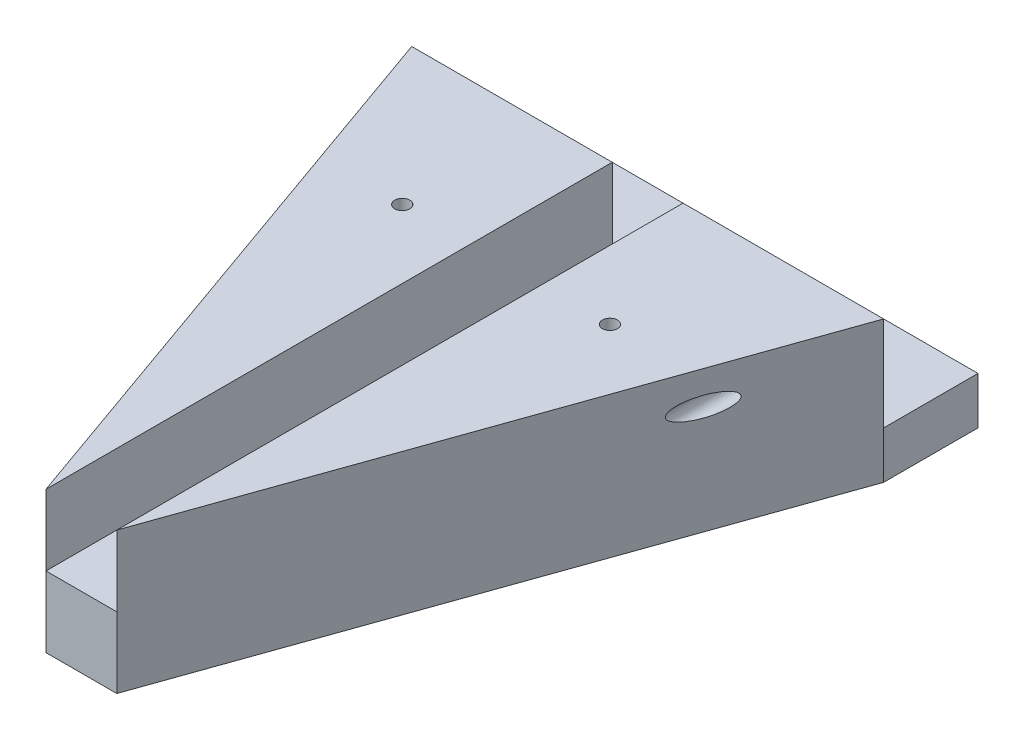
ISO-10303-21;
HEADER;
FILE_DESCRIPTION(('STEP AP214'),'2;1');
FILE_NAME('part.step','',(''),(''),'','','');
FILE_SCHEMA(('AUTOMOTIVE_DESIGN { 1 0 10303 214 1 1 1 1 }'));
ENDSEC;
DATA;
#1=APPLICATION_CONTEXT('core data for automotive mechanical design processes');
#2=APPLICATION_PROTOCOL_DEFINITION('international standard','automotive_design',2000,#1);
#3=PRODUCT_CONTEXT('',#1,'mechanical');
#4=PRODUCT('Part','Part','',(#3));
#5=PRODUCT_RELATED_PRODUCT_CATEGORY('part','',(#4));
#6=PRODUCT_DEFINITION_FORMATION('','',#4);
#7=PRODUCT_DEFINITION_CONTEXT('part definition',#1,'design');
#8=PRODUCT_DEFINITION('design','',#6,#7);
#9=PRODUCT_DEFINITION_SHAPE('','',#8);
#10=(LENGTH_UNIT() NAMED_UNIT(*) SI_UNIT(.MILLI.,.METRE.));
#11=(NAMED_UNIT(*) PLANE_ANGLE_UNIT() SI_UNIT($,.RADIAN.));
#12=(NAMED_UNIT(*) SI_UNIT($,.STERADIAN.) SOLID_ANGLE_UNIT());
#13=UNCERTAINTY_MEASURE_WITH_UNIT(LENGTH_MEASURE(1.E-05),#10,'distance_accuracy_value','');
#14=(GEOMETRIC_REPRESENTATION_CONTEXT(3) GLOBAL_UNCERTAINTY_ASSIGNED_CONTEXT((#13)) GLOBAL_UNIT_ASSIGNED_CONTEXT((#10,
#11,#12)) REPRESENTATION_CONTEXT('',''));
#15=CARTESIAN_POINT('',(0.,0.,0.));
#16=DIRECTION('',(0.,0.,1.));
#17=DIRECTION('',(1.,0.,0.));
#18=AXIS2_PLACEMENT_3D('',#15,#16,#17);
#19=CARTESIAN_POINT('',(0.,15.,0.));
#20=DIRECTION('',(0.,1.,0.));
#21=DIRECTION('',(0.,0.,1.));
#22=AXIS2_PLACEMENT_3D('',#19,#20,#21);
#23=PLANE('',#22);
#24=DIRECTION('',(1.,0.,0.));
#25=VECTOR('',#24,1.);
#26=CARTESIAN_POINT('',(0.,15.,10.));
#27=LINE('',#26,#25);
#28=CARTESIAN_POINT('',(-7.49999999999999,15.,10.));
#29=VERTEX_POINT('',#28);
#30=CARTESIAN_POINT('',(7.50000000000001,15.,10.));
#31=VERTEX_POINT('',#30);
#32=EDGE_CURVE('E200',#29,#31,#27,.T.);
#33=ORIENTED_EDGE('',*,*,#32,.F.);
#34=DIRECTION('',(0.,0.,1.));
#35=VECTOR('',#34,1.);
#36=CARTESIAN_POINT('',(-7.5,15.,0.));
#37=LINE('',#36,#35);
#38=CARTESIAN_POINT('',(-7.49999999999999,15.,130.));
#39=VERTEX_POINT('',#38);
#40=EDGE_CURVE('E11',#29,#39,#37,.T.);
#41=ORIENTED_EDGE('',*,*,#40,.T.);
#42=DIRECTION('',(1.,0.,0.));
#43=VECTOR('',#42,1.);
#44=CARTESIAN_POINT('',(0.,15.,130.));
#45=LINE('',#44,#43);
#46=CARTESIAN_POINT('',(7.50000000000001,15.,130.));
#47=VERTEX_POINT('',#46);
#48=EDGE_CURVE('E191',#39,#47,#45,.T.);
#49=ORIENTED_EDGE('',*,*,#48,.T.);
#50=DIRECTION('',(0.,0.,1.));
#51=VECTOR('',#50,1.);
#52=CARTESIAN_POINT('',(7.5,15.,0.));
#53=LINE('',#52,#51);
#54=EDGE_CURVE('E60',#31,#47,#53,.T.);
#55=ORIENTED_EDGE('',*,*,#54,.F.);
#56=EDGE_LOOP('',(#33,#41,#49,#55));
#57=FACE_BOUND('',#56,.T.);
#58=ADVANCED_FACE('F50',(#57),#23,.T.);
#59=CARTESIAN_POINT('',(0.,10.,130.));
#60=DIRECTION('',(0.,0.,-1.));
#61=DIRECTION('',(-1.,0.,0.));
#62=AXIS2_PLACEMENT_3D('',#59,#60,#61);
#63=PLANE('',#62);
#64=DIRECTION('',(1.,0.,0.));
#65=VECTOR('',#64,1.);
#66=CARTESIAN_POINT('',(0.,0.,130.));
#67=LINE('',#66,#65);
#68=CARTESIAN_POINT('',(-7.49999999999999,0.,130.));
#69=VERTEX_POINT('',#68);
#70=CARTESIAN_POINT('',(7.50000000000001,0.,130.));
#71=VERTEX_POINT('',#70);
#72=EDGE_CURVE('E206',#69,#71,#67,.T.);
#73=ORIENTED_EDGE('',*,*,#72,.T.);
#74=DIRECTION('',(0.,-1.,0.));
#75=VECTOR('',#74,1.);
#76=CARTESIAN_POINT('',(7.50000000000001,10.,130.));
#77=LINE('',#76,#75);
#78=EDGE_CURVE('E254',#47,#71,#77,.T.);
#79=ORIENTED_EDGE('',*,*,#78,.F.);
#80=ORIENTED_EDGE('',*,*,#48,.F.);
#81=DIRECTION('',(0.,-1.,0.));
#82=VECTOR('',#81,1.);
#83=CARTESIAN_POINT('',(-7.49999999999999,10.,130.));
#84=LINE('',#83,#82);
#85=EDGE_CURVE('E99',#39,#69,#84,.T.);
#86=ORIENTED_EDGE('',*,*,#85,.T.);
#87=EDGE_LOOP('',(#73,#79,#80,#86));
#88=FACE_BOUND('',#87,.T.);
#89=ADVANCED_FACE('F47',(#88),#63,.F.);
#90=CARTESIAN_POINT('',(47.5742383339761,10.,16.8492094099499));
#91=DIRECTION('',(-0.942627225161207,0.,-0.333847142244594));
#92=DIRECTION('',(-0.333847142244594,0.,0.942627225161207));
#93=AXIS2_PLACEMENT_3D('',#90,#91,#92);
#94=PLANE('',#93);
#95=CARTESIAN_POINT('',(40.,23.,38.2352941176471));
#96=DIRECTION('',(-0.942627225161207,0.,-0.333847142244594));
#97=DIRECTION('',(0.333847142244594,0.,-0.942627225161207));
#98=AXIS2_PLACEMENT_3D('',#95,#96,#97);
#99=ELLIPSE('',#98,6.29030395731657,2.1);
#100=CARTESIAN_POINT('',(42.1,23.,32.3058823529412));
#101=VERTEX_POINT('',#100);
#102=EDGE_CURVE('E51',#101,#101,#99,.T.);
#103=ORIENTED_EDGE('',*,*,#102,.T.);
#104=EDGE_LOOP('',(#103));
#105=FACE_BOUND('',#104,.T.);
#106=ORIENTED_EDGE('',*,*,#78,.T.);
#107=DIRECTION('',(0.333847142244594,0.,-0.942627225161207));
#108=VECTOR('',#107,1.);
#109=CARTESIAN_POINT('',(47.5742383339761,0.,16.8492094099499));
#110=LINE('',#109,#108);
#111=CARTESIAN_POINT('',(50.,0.,10.));
#112=VERTEX_POINT('',#111);
#113=EDGE_CURVE('E224',#71,#112,#110,.T.);
#114=ORIENTED_EDGE('',*,*,#113,.T.);
#115=DIRECTION('',(0.,-1.,0.));
#116=VECTOR('',#115,1.);
#117=CARTESIAN_POINT('',(50.,10.,10.));
#118=LINE('',#117,#116);
#119=CARTESIAN_POINT('',(50.,10.,10.));
#120=VERTEX_POINT('',#119);
#121=EDGE_CURVE('E248',#120,#112,#118,.T.);
#122=ORIENTED_EDGE('',*,*,#121,.F.);
#123=DIRECTION('',(0.,-1.,0.));
#124=VECTOR('',#123,1.);
#125=CARTESIAN_POINT('',(50.,15.,10.));
#126=LINE('',#125,#124);
#127=CARTESIAN_POINT('',(50.,30.,10.));
#128=VERTEX_POINT('',#127);
#129=EDGE_CURVE('E201',#128,#120,#126,.T.);
#130=ORIENTED_EDGE('',*,*,#129,.F.);
#131=DIRECTION('',(0.333847142244594,0.,-0.942627225161207));
#132=VECTOR('',#131,1.);
#133=CARTESIAN_POINT('',(47.5742383339761,30.,16.8492094099499));
#134=LINE('',#133,#132);
#135=CARTESIAN_POINT('',(7.50000000000001,30.,130.));
#136=VERTEX_POINT('',#135);
#137=EDGE_CURVE('E172',#136,#128,#134,.T.);
#138=ORIENTED_EDGE('',*,*,#137,.F.);
#139=DIRECTION('',(0.,-1.,0.));
#140=VECTOR('',#139,1.);
#141=CARTESIAN_POINT('',(7.50000000000001,30.,130.));
#142=LINE('',#141,#140);
#143=EDGE_CURVE('E157',#136,#47,#142,.T.);
#144=ORIENTED_EDGE('',*,*,#143,.T.);
#145=EDGE_LOOP('',(#106,#114,#122,#130,#138,#144));
#146=FACE_BOUND('',#145,.T.);
#147=ADVANCED_FACE('F327',(#105,#146),#94,.F.);
#148=CARTESIAN_POINT('',(50.,10.,0.));
#149=DIRECTION('',(-1.,0.,0.));
#150=DIRECTION('',(0.,0.,1.));
#151=AXIS2_PLACEMENT_3D('',#148,#149,#150);
#152=PLANE('',#151);
#153=DIRECTION('',(0.,0.,-1.));
#154=VECTOR('',#153,1.);
#155=CARTESIAN_POINT('',(50.,0.,0.));
#156=LINE('',#155,#154);
#157=CARTESIAN_POINT('',(50.,0.,-10.));
#158=VERTEX_POINT('',#157);
#159=EDGE_CURVE('E223',#112,#158,#156,.T.);
#160=ORIENTED_EDGE('',*,*,#159,.T.);
#161=DIRECTION('',(0.,-1.,0.));
#162=VECTOR('',#161,1.);
#163=CARTESIAN_POINT('',(50.,10.,-10.));
#164=LINE('',#163,#162);
#165=CARTESIAN_POINT('',(50.,10.,-10.));
#166=VERTEX_POINT('',#165);
#167=EDGE_CURVE('E246',#166,#158,#164,.T.);
#168=ORIENTED_EDGE('',*,*,#167,.F.);
#169=DIRECTION('',(0.,0.,-1.));
#170=VECTOR('',#169,1.);
#171=CARTESIAN_POINT('',(50.,10.,0.));
#172=LINE('',#171,#170);
#173=EDGE_CURVE('E209',#120,#166,#172,.T.);
#174=ORIENTED_EDGE('',*,*,#173,.F.);
#175=ORIENTED_EDGE('',*,*,#121,.T.);
#176=EDGE_LOOP('',(#160,#168,#174,#175));
#177=FACE_BOUND('',#176,.T.);
#178=ADVANCED_FACE('F323',(#177),#152,.F.);
#179=CARTESIAN_POINT('',(0.,10.,-10.));
#180=DIRECTION('',(0.,0.,-1.));
#181=DIRECTION('',(-1.,0.,0.));
#182=AXIS2_PLACEMENT_3D('',#179,#180,#181);
#183=PLANE('',#182);
#184=DIRECTION('',(1.,0.,0.));
#185=VECTOR('',#184,1.);
#186=CARTESIAN_POINT('',(0.,0.,-10.));
#187=LINE('',#186,#185);
#188=CARTESIAN_POINT('',(-50.,0.,-10.));
#189=VERTEX_POINT('',#188);
#190=EDGE_CURVE('E230',#189,#158,#187,.T.);
#191=ORIENTED_EDGE('',*,*,#190,.F.);
#192=DIRECTION('',(0.,-1.,0.));
#193=VECTOR('',#192,1.);
#194=CARTESIAN_POINT('',(-50.,10.,-10.));
#195=LINE('',#194,#193);
#196=CARTESIAN_POINT('',(-50.,10.,-10.));
#197=VERTEX_POINT('',#196);
#198=EDGE_CURVE('E75',#197,#189,#195,.T.);
#199=ORIENTED_EDGE('',*,*,#198,.F.);
#200=DIRECTION('',(1.,0.,0.));
#201=VECTOR('',#200,1.);
#202=CARTESIAN_POINT('',(0.,10.,-10.));
#203=LINE('',#202,#201);
#204=EDGE_CURVE('E215',#197,#166,#203,.T.);
#205=ORIENTED_EDGE('',*,*,#204,.T.);
#206=ORIENTED_EDGE('',*,*,#167,.T.);
#207=EDGE_LOOP('',(#191,#199,#205,#206));
#208=FACE_BOUND('',#207,.T.);
#209=ADVANCED_FACE('F322',(#208),#183,.T.);
#210=CARTESIAN_POINT('',(-50.,10.,0.));
#211=DIRECTION('',(-1.,0.,0.));
#212=DIRECTION('',(0.,0.,1.));
#213=AXIS2_PLACEMENT_3D('',#210,#211,#212);
#214=PLANE('',#213);
#215=DIRECTION('',(0.,0.,-1.));
#216=VECTOR('',#215,1.);
#217=CARTESIAN_POINT('',(-50.,0.,0.));
#218=LINE('',#217,#216);
#219=CARTESIAN_POINT('',(-50.,0.,10.));
#220=VERTEX_POINT('',#219);
#221=EDGE_CURVE('E231',#220,#189,#218,.T.);
#222=ORIENTED_EDGE('',*,*,#221,.F.);
#223=DIRECTION('',(0.,-1.,0.));
#224=VECTOR('',#223,1.);
#225=CARTESIAN_POINT('',(-50.,10.,10.));
#226=LINE('',#225,#224);
#227=CARTESIAN_POINT('',(-50.,10.,10.));
#228=VERTEX_POINT('',#227);
#229=EDGE_CURVE('E241',#228,#220,#226,.T.);
#230=ORIENTED_EDGE('',*,*,#229,.F.);
#231=DIRECTION('',(0.,0.,-1.));
#232=VECTOR('',#231,1.);
#233=CARTESIAN_POINT('',(-50.,10.,0.));
#234=LINE('',#233,#232);
#235=EDGE_CURVE('E216',#228,#197,#234,.T.);
#236=ORIENTED_EDGE('',*,*,#235,.T.);
#237=ORIENTED_EDGE('',*,*,#198,.T.);
#238=EDGE_LOOP('',(#222,#230,#236,#237));
#239=FACE_BOUND('',#238,.T.);
#240=ADVANCED_FACE('F318',(#239),#214,.T.);
#241=CARTESIAN_POINT('',(-47.5742383339761,10.,16.8492094099499));
#242=DIRECTION('',(0.942627225161207,0.,-0.333847142244594));
#243=DIRECTION('',(-0.333847142244594,0.,-0.942627225161207));
#244=AXIS2_PLACEMENT_3D('',#241,#242,#243);
#245=PLANE('',#244);
#246=CARTESIAN_POINT('',(-40.,23.,38.2352941176471));
#247=DIRECTION('',(0.942627225161207,0.,-0.333847142244594));
#248=DIRECTION('',(-0.333847142244594,0.,-0.942627225161207));
#249=AXIS2_PLACEMENT_3D('',#246,#247,#248);
#250=ELLIPSE('',#249,6.29030395731656,2.1);
#251=CARTESIAN_POINT('',(-42.1,23.,32.3058823529412));
#252=VERTEX_POINT('',#251);
#253=EDGE_CURVE('E274',#252,#252,#250,.T.);
#254=ORIENTED_EDGE('',*,*,#253,.T.);
#255=EDGE_LOOP('',(#254));
#256=FACE_BOUND('',#255,.T.);
#257=DIRECTION('',(0.,-1.,0.));
#258=VECTOR('',#257,1.);
#259=CARTESIAN_POINT('',(-50.,15.,10.));
#260=LINE('',#259,#258);
#261=CARTESIAN_POINT('',(-50.,30.,10.));
#262=VERTEX_POINT('',#261);
#263=EDGE_CURVE('E202',#262,#228,#260,.T.);
#264=ORIENTED_EDGE('',*,*,#263,.T.);
#265=ORIENTED_EDGE('',*,*,#229,.T.);
#266=DIRECTION('',(0.333847142244594,0.,0.942627225161207));
#267=VECTOR('',#266,1.);
#268=CARTESIAN_POINT('',(-47.5742383339761,0.,16.8492094099499));
#269=LINE('',#268,#267);
#270=EDGE_CURVE('E214',#220,#69,#269,.T.);
#271=ORIENTED_EDGE('',*,*,#270,.T.);
#272=ORIENTED_EDGE('',*,*,#85,.F.);
#273=DIRECTION('',(0.,-1.,0.));
#274=VECTOR('',#273,1.);
#275=CARTESIAN_POINT('',(-7.49999999999999,30.,130.));
#276=LINE('',#275,#274);
#277=CARTESIAN_POINT('',(-7.49999999999999,30.,130.));
#278=VERTEX_POINT('',#277);
#279=EDGE_CURVE('E142',#278,#39,#276,.T.);
#280=ORIENTED_EDGE('',*,*,#279,.F.);
#281=DIRECTION('',(0.333847142244594,0.,0.942627225161207));
#282=VECTOR('',#281,1.);
#283=CARTESIAN_POINT('',(-47.5742383339761,30.,16.8492094099499));
#284=LINE('',#283,#282);
#285=EDGE_CURVE('E146',#262,#278,#284,.T.);
#286=ORIENTED_EDGE('',*,*,#285,.F.);
#287=EDGE_LOOP('',(#264,#265,#271,#272,#280,#286));
#288=FACE_BOUND('',#287,.T.);
#289=ADVANCED_FACE('F160',(#256,#288),#245,.F.);
#290=CARTESIAN_POINT('',(0.,10.,0.));
#291=DIRECTION('',(0.,1.,0.));
#292=DIRECTION('',(0.,0.,1.));
#293=AXIS2_PLACEMENT_3D('',#290,#291,#292);
#294=PLANE('',#293);
#295=CARTESIAN_POINT('',(20.,10.,0.));
#296=DIRECTION('',(0.,1.,0.));
#297=DIRECTION('',(0.,0.,1.));
#298=AXIS2_PLACEMENT_3D('',#295,#296,#297);
#299=CIRCLE('',#298,1.60000000000001);
#300=CARTESIAN_POINT('',(20.,10.,1.60000000000001));
#301=VERTEX_POINT('',#300);
#302=EDGE_CURVE('E164',#301,#301,#299,.T.);
#303=ORIENTED_EDGE('',*,*,#302,.F.);
#304=EDGE_LOOP('',(#303));
#305=FACE_BOUND('',#304,.T.);
#306=CARTESIAN_POINT('',(-20.,10.,0.));
#307=DIRECTION('',(0.,1.,0.));
#308=DIRECTION('',(0.,0.,1.));
#309=AXIS2_PLACEMENT_3D('',#306,#307,#308);
#310=CIRCLE('',#309,1.6);
#311=CARTESIAN_POINT('',(-20.,10.,1.6));
#312=VERTEX_POINT('',#311);
#313=EDGE_CURVE('E158',#312,#312,#310,.T.);
#314=ORIENTED_EDGE('',*,*,#313,.F.);
#315=EDGE_LOOP('',(#314));
#316=FACE_BOUND('',#315,.T.);
#317=DIRECTION('',(-1.,0.,0.));
#318=VECTOR('',#317,1.);
#319=CARTESIAN_POINT('',(0.,10.,10.));
#320=LINE('',#319,#318);
#321=EDGE_CURVE('E106',#120,#228,#320,.T.);
#322=ORIENTED_EDGE('',*,*,#321,.F.);
#323=ORIENTED_EDGE('',*,*,#173,.T.);
#324=ORIENTED_EDGE('',*,*,#204,.F.);
#325=ORIENTED_EDGE('',*,*,#235,.F.);
#326=EDGE_LOOP('',(#322,#323,#324,#325));
#327=FACE_BOUND('',#326,.T.);
#328=ADVANCED_FACE('F347',(#305,#316,#327),#294,.T.);
#329=CARTESIAN_POINT('',(0.,0.,0.));
#330=DIRECTION('',(0.,1.,0.));
#331=DIRECTION('',(0.,0.,1.));
#332=AXIS2_PLACEMENT_3D('',#329,#330,#331);
#333=PLANE('',#332);
#334=CARTESIAN_POINT('',(22.,0.,40.));
#335=DIRECTION('',(0.,1.,0.));
#336=DIRECTION('',(0.,0.,1.));
#337=AXIS2_PLACEMENT_3D('',#334,#335,#336);
#338=CIRCLE('',#337,1.6);
#339=CARTESIAN_POINT('',(22.,0.,41.6));
#340=VERTEX_POINT('',#339);
#341=EDGE_CURVE('E174',#340,#340,#338,.T.);
#342=ORIENTED_EDGE('',*,*,#341,.T.);
#343=EDGE_LOOP('',(#342));
#344=FACE_BOUND('',#343,.T.);
#345=CARTESIAN_POINT('',(-22.,0.,40.));
#346=DIRECTION('',(0.,1.,0.));
#347=DIRECTION('',(0.,0.,1.));
#348=AXIS2_PLACEMENT_3D('',#345,#346,#347);
#349=CIRCLE('',#348,1.6);
#350=CARTESIAN_POINT('',(-22.,0.,41.6));
#351=VERTEX_POINT('',#350);
#352=EDGE_CURVE('E297',#351,#351,#349,.T.);
#353=ORIENTED_EDGE('',*,*,#352,.T.);
#354=EDGE_LOOP('',(#353));
#355=FACE_BOUND('',#354,.T.);
#356=CARTESIAN_POINT('',(20.,0.,0.));
#357=DIRECTION('',(0.,1.,0.));
#358=DIRECTION('',(0.,0.,1.));
#359=AXIS2_PLACEMENT_3D('',#356,#357,#358);
#360=CIRCLE('',#359,1.60000000000001);
#361=CARTESIAN_POINT('',(20.,0.,1.60000000000001));
#362=VERTEX_POINT('',#361);
#363=EDGE_CURVE('E197',#362,#362,#360,.T.);
#364=ORIENTED_EDGE('',*,*,#363,.T.);
#365=EDGE_LOOP('',(#364));
#366=FACE_BOUND('',#365,.T.);
#367=CARTESIAN_POINT('',(-20.,0.,0.));
#368=DIRECTION('',(0.,1.,0.));
#369=DIRECTION('',(0.,0.,1.));
#370=AXIS2_PLACEMENT_3D('',#367,#368,#369);
#371=CIRCLE('',#370,1.6);
#372=CARTESIAN_POINT('',(-20.,0.,1.6));
#373=VERTEX_POINT('',#372);
#374=EDGE_CURVE('E195',#373,#373,#371,.T.);
#375=ORIENTED_EDGE('',*,*,#374,.T.);
#376=EDGE_LOOP('',(#375));
#377=FACE_BOUND('',#376,.T.);
#378=ORIENTED_EDGE('',*,*,#270,.F.);
#379=ORIENTED_EDGE('',*,*,#221,.T.);
#380=ORIENTED_EDGE('',*,*,#190,.T.);
#381=ORIENTED_EDGE('',*,*,#159,.F.);
#382=ORIENTED_EDGE('',*,*,#113,.F.);
#383=ORIENTED_EDGE('',*,*,#72,.F.);
#384=EDGE_LOOP('',(#378,#379,#380,#381,#382,#383));
#385=FACE_BOUND('',#384,.T.);
#386=ADVANCED_FACE('F319',(#344,#355,#366,#377,#385),#333,.F.);
#387=CARTESIAN_POINT('',(0.,15.,10.));
#388=DIRECTION('',(0.,0.,-1.));
#389=DIRECTION('',(-1.,0.,0.));
#390=AXIS2_PLACEMENT_3D('',#387,#388,#389);
#391=PLANE('',#390);
#392=CARTESIAN_POINT('',(-40.,23.,10.));
#393=DIRECTION('',(0.,0.,-1.));
#394=DIRECTION('',(-1.,0.,0.));
#395=AXIS2_PLACEMENT_3D('',#392,#393,#394);
#396=CIRCLE('',#395,1.6);
#397=CARTESIAN_POINT('',(-41.6,23.,10.));
#398=VERTEX_POINT('',#397);
#399=EDGE_CURVE('E287',#398,#398,#396,.T.);
#400=ORIENTED_EDGE('',*,*,#399,.F.);
#401=EDGE_LOOP('',(#400));
#402=FACE_BOUND('',#401,.T.);
#403=CARTESIAN_POINT('',(40.,23.,10.));
#404=DIRECTION('',(0.,0.,-1.));
#405=DIRECTION('',(-1.,0.,0.));
#406=AXIS2_PLACEMENT_3D('',#403,#404,#405);
#407=CIRCLE('',#406,1.6);
#408=CARTESIAN_POINT('',(38.4,23.,10.));
#409=VERTEX_POINT('',#408);
#410=EDGE_CURVE('E281',#409,#409,#407,.T.);
#411=ORIENTED_EDGE('',*,*,#410,.F.);
#412=EDGE_LOOP('',(#411));
#413=FACE_BOUND('',#412,.T.);
#414=ORIENTED_EDGE('',*,*,#321,.T.);
#415=ORIENTED_EDGE('',*,*,#263,.F.);
#416=DIRECTION('',(1.,0.,0.));
#417=VECTOR('',#416,1.);
#418=CARTESIAN_POINT('',(0.,30.,10.));
#419=LINE('',#418,#417);
#420=CARTESIAN_POINT('',(-7.49999999999999,30.,10.));
#421=VERTEX_POINT('',#420);
#422=EDGE_CURVE('E149',#262,#421,#419,.T.);
#423=ORIENTED_EDGE('',*,*,#422,.T.);
#424=DIRECTION('',(0.,-1.,0.));
#425=VECTOR('',#424,1.);
#426=CARTESIAN_POINT('',(-7.49999999999999,30.,10.));
#427=LINE('',#426,#425);
#428=EDGE_CURVE('E141',#421,#29,#427,.T.);
#429=ORIENTED_EDGE('',*,*,#428,.T.);
#430=ORIENTED_EDGE('',*,*,#32,.T.);
#431=DIRECTION('',(0.,-1.,0.));
#432=VECTOR('',#431,1.);
#433=CARTESIAN_POINT('',(7.5,30.,10.));
#434=LINE('',#433,#432);
#435=CARTESIAN_POINT('',(7.5,30.,10.));
#436=VERTEX_POINT('',#435);
#437=EDGE_CURVE('E182',#436,#31,#434,.T.);
#438=ORIENTED_EDGE('',*,*,#437,.F.);
#439=DIRECTION('',(1.,0.,0.));
#440=VECTOR('',#439,1.);
#441=CARTESIAN_POINT('',(0.,30.,10.));
#442=LINE('',#441,#440);
#443=EDGE_CURVE('E177',#436,#128,#442,.T.);
#444=ORIENTED_EDGE('',*,*,#443,.T.);
#445=ORIENTED_EDGE('',*,*,#129,.T.);
#446=EDGE_LOOP('',(#414,#415,#423,#429,#430,#438,#444,#445));
#447=FACE_BOUND('',#446,.T.);
#448=ADVANCED_FACE('F311',(#402,#413,#447),#391,.T.);
#449=CARTESIAN_POINT('',(-20.,-5.,0.));
#450=DIRECTION('',(0.,1.,0.));
#451=DIRECTION('',(0.,0.,1.));
#452=AXIS2_PLACEMENT_3D('',#449,#450,#451);
#453=CYLINDRICAL_SURFACE('',#452,1.6);
#454=ORIENTED_EDGE('',*,*,#313,.T.);
#455=EDGE_LOOP('',(#454));
#456=FACE_BOUND('',#455,.T.);
#457=ORIENTED_EDGE('',*,*,#374,.F.);
#458=EDGE_LOOP('',(#457));
#459=FACE_BOUND('',#458,.T.);
#460=ADVANCED_FACE('F344',(#456,#459),#453,.F.);
#461=CARTESIAN_POINT('',(20.,-5.,0.));
#462=DIRECTION('',(0.,1.,0.));
#463=DIRECTION('',(0.,0.,1.));
#464=AXIS2_PLACEMENT_3D('',#461,#462,#463);
#465=CYLINDRICAL_SURFACE('',#464,1.60000000000001);
#466=ORIENTED_EDGE('',*,*,#302,.T.);
#467=EDGE_LOOP('',(#466));
#468=FACE_BOUND('',#467,.T.);
#469=ORIENTED_EDGE('',*,*,#363,.F.);
#470=EDGE_LOOP('',(#469));
#471=FACE_BOUND('',#470,.T.);
#472=ADVANCED_FACE('F485',(#468,#471),#465,.F.);
#473=CARTESIAN_POINT('',(7.5,30.,0.));
#474=DIRECTION('',(-1.,0.,0.));
#475=DIRECTION('',(0.,0.,1.));
#476=AXIS2_PLACEMENT_3D('',#473,#474,#475);
#477=PLANE('',#476);
#478=ORIENTED_EDGE('',*,*,#437,.T.);
#479=ORIENTED_EDGE('',*,*,#54,.T.);
#480=ORIENTED_EDGE('',*,*,#143,.F.);
#481=DIRECTION('',(0.,0.,-1.));
#482=VECTOR('',#481,1.);
#483=CARTESIAN_POINT('',(7.5,30.,0.));
#484=LINE('',#483,#482);
#485=EDGE_CURVE('E167',#136,#436,#484,.T.);
#486=ORIENTED_EDGE('',*,*,#485,.T.);
#487=EDGE_LOOP('',(#478,#479,#480,#486));
#488=FACE_BOUND('',#487,.T.);
#489=ADVANCED_FACE('F334',(#488),#477,.T.);
#490=CARTESIAN_POINT('',(0.,30.,0.));
#491=DIRECTION('',(0.,1.,0.));
#492=DIRECTION('',(0.,0.,1.));
#493=AXIS2_PLACEMENT_3D('',#490,#491,#492);
#494=PLANE('',#493);
#495=CARTESIAN_POINT('',(22.,30.,40.));
#496=DIRECTION('',(0.,1.,0.));
#497=DIRECTION('',(0.,0.,1.));
#498=AXIS2_PLACEMENT_3D('',#495,#496,#497);
#499=CIRCLE('',#498,1.6);
#500=CARTESIAN_POINT('',(22.,30.,41.6));
#501=VERTEX_POINT('',#500);
#502=EDGE_CURVE('E298',#501,#501,#499,.T.);
#503=ORIENTED_EDGE('',*,*,#502,.F.);
#504=EDGE_LOOP('',(#503));
#505=FACE_BOUND('',#504,.T.);
#506=ORIENTED_EDGE('',*,*,#485,.F.);
#507=ORIENTED_EDGE('',*,*,#137,.T.);
#508=ORIENTED_EDGE('',*,*,#443,.F.);
#509=EDGE_LOOP('',(#506,#507,#508));
#510=FACE_BOUND('',#509,.T.);
#511=ADVANCED_FACE('F466',(#505,#510),#494,.T.);
#512=CARTESIAN_POINT('',(-7.5,30.,0.));
#513=DIRECTION('',(-1.,0.,0.));
#514=DIRECTION('',(0.,0.,1.));
#515=AXIS2_PLACEMENT_3D('',#512,#513,#514);
#516=PLANE('',#515);
#517=ORIENTED_EDGE('',*,*,#40,.F.);
#518=ORIENTED_EDGE('',*,*,#428,.F.);
#519=DIRECTION('',(0.,0.,-1.));
#520=VECTOR('',#519,1.);
#521=CARTESIAN_POINT('',(-7.5,30.,0.));
#522=LINE('',#521,#520);
#523=EDGE_CURVE('E139',#278,#421,#522,.T.);
#524=ORIENTED_EDGE('',*,*,#523,.F.);
#525=ORIENTED_EDGE('',*,*,#279,.T.);
#526=EDGE_LOOP('',(#517,#518,#524,#525));
#527=FACE_BOUND('',#526,.T.);
#528=ADVANCED_FACE('F136',(#527),#516,.F.);
#529=CARTESIAN_POINT('',(0.,30.,0.));
#530=DIRECTION('',(0.,1.,0.));
#531=DIRECTION('',(0.,0.,1.));
#532=AXIS2_PLACEMENT_3D('',#529,#530,#531);
#533=PLANE('',#532);
#534=CARTESIAN_POINT('',(-22.,30.,40.));
#535=DIRECTION('',(0.,1.,0.));
#536=DIRECTION('',(0.,0.,1.));
#537=AXIS2_PLACEMENT_3D('',#534,#535,#536);
#538=CIRCLE('',#537,1.6);
#539=CARTESIAN_POINT('',(-22.,30.,41.6));
#540=VERTEX_POINT('',#539);
#541=EDGE_CURVE('E292',#540,#540,#538,.T.);
#542=ORIENTED_EDGE('',*,*,#541,.F.);
#543=EDGE_LOOP('',(#542));
#544=FACE_BOUND('',#543,.T.);
#545=ORIENTED_EDGE('',*,*,#285,.T.);
#546=ORIENTED_EDGE('',*,*,#523,.T.);
#547=ORIENTED_EDGE('',*,*,#422,.F.);
#548=EDGE_LOOP('',(#545,#546,#547));
#549=FACE_BOUND('',#548,.T.);
#550=ADVANCED_FACE('F155',(#544,#549),#533,.T.);
#551=CARTESIAN_POINT('',(-22.,-70.,40.));
#552=DIRECTION('',(0.,1.,0.));
#553=DIRECTION('',(0.,0.,1.));
#554=AXIS2_PLACEMENT_3D('',#551,#552,#553);
#555=CYLINDRICAL_SURFACE('',#554,1.6);
#556=ORIENTED_EDGE('',*,*,#541,.T.);
#557=EDGE_LOOP('',(#556));
#558=FACE_BOUND('',#557,.T.);
#559=ORIENTED_EDGE('',*,*,#352,.F.);
#560=EDGE_LOOP('',(#559));
#561=FACE_BOUND('',#560,.T.);
#562=ADVANCED_FACE('F442',(#558,#561),#555,.F.);
#563=CARTESIAN_POINT('',(22.,-70.,40.));
#564=DIRECTION('',(0.,1.,0.));
#565=DIRECTION('',(0.,0.,1.));
#566=AXIS2_PLACEMENT_3D('',#563,#564,#565);
#567=CYLINDRICAL_SURFACE('',#566,1.6);
#568=ORIENTED_EDGE('',*,*,#502,.T.);
#569=EDGE_LOOP('',(#568));
#570=FACE_BOUND('',#569,.T.);
#571=ORIENTED_EDGE('',*,*,#341,.F.);
#572=EDGE_LOOP('',(#571));
#573=FACE_BOUND('',#572,.T.);
#574=ADVANCED_FACE('F381',(#570,#573),#567,.F.);
#575=CARTESIAN_POINT('',(40.,23.,110.));
#576=DIRECTION('',(0.,0.,-1.));
#577=DIRECTION('',(-1.,0.,0.));
#578=AXIS2_PLACEMENT_3D('',#575,#576,#577);
#579=CYLINDRICAL_SURFACE('',#578,1.6);
#580=CARTESIAN_POINT('',(40.,23.,30.));
#581=DIRECTION('',(0.,0.,-1.));
#582=DIRECTION('',(-1.,0.,0.));
#583=AXIS2_PLACEMENT_3D('',#580,#581,#582);
#584=CIRCLE('',#583,1.6);
#585=CARTESIAN_POINT('',(38.4,23.,30.));
#586=VERTEX_POINT('',#585);
#587=EDGE_CURVE('E268',#586,#586,#584,.F.);
#588=ORIENTED_EDGE('',*,*,#587,.T.);
#589=EDGE_LOOP('',(#588));
#590=FACE_BOUND('',#589,.T.);
#591=ORIENTED_EDGE('',*,*,#410,.T.);
#592=EDGE_LOOP('',(#591));
#593=FACE_BOUND('',#592,.T.);
#594=ADVANCED_FACE('F378',(#590,#593),#579,.F.);
#595=CARTESIAN_POINT('',(-40.,23.,110.));
#596=DIRECTION('',(0.,0.,-1.));
#597=DIRECTION('',(-1.,0.,0.));
#598=AXIS2_PLACEMENT_3D('',#595,#596,#597);
#599=CYLINDRICAL_SURFACE('',#598,1.6);
#600=CARTESIAN_POINT('',(-40.,23.,30.));
#601=DIRECTION('',(0.,0.,-1.));
#602=DIRECTION('',(-1.,0.,0.));
#603=AXIS2_PLACEMENT_3D('',#600,#601,#602);
#604=CIRCLE('',#603,1.6);
#605=CARTESIAN_POINT('',(-41.6,23.,30.));
#606=VERTEX_POINT('',#605);
#607=EDGE_CURVE('E267',#606,#606,#604,.F.);
#608=ORIENTED_EDGE('',*,*,#607,.T.);
#609=EDGE_LOOP('',(#608));
#610=FACE_BOUND('',#609,.T.);
#611=ORIENTED_EDGE('',*,*,#399,.T.);
#612=EDGE_LOOP('',(#611));
#613=FACE_BOUND('',#612,.T.);
#614=ADVANCED_FACE('F384',(#610,#613),#599,.F.);
#615=CARTESIAN_POINT('',(-40.,23.,130.));
#616=DIRECTION('',(0.,0.,-1.));
#617=DIRECTION('',(-1.,0.,0.));
#618=AXIS2_PLACEMENT_3D('',#615,#616,#617);
#619=CYLINDRICAL_SURFACE('',#618,2.1);
#620=CARTESIAN_POINT('',(-40.,23.,30.));
#621=DIRECTION('',(0.,0.,-1.));
#622=DIRECTION('',(-1.,0.,0.));
#623=AXIS2_PLACEMENT_3D('',#620,#621,#622);
#624=CIRCLE('',#623,2.1);
#625=CARTESIAN_POINT('',(-42.1,23.,30.));
#626=VERTEX_POINT('',#625);
#627=EDGE_CURVE('E625',#626,#626,#624,.T.);
#628=ORIENTED_EDGE('',*,*,#627,.T.);
#629=EDGE_LOOP('',(#628));
#630=FACE_BOUND('',#629,.T.);
#631=ORIENTED_EDGE('',*,*,#253,.F.);
#632=EDGE_LOOP('',(#631));
#633=FACE_BOUND('',#632,.T.);
#634=ADVANCED_FACE('F393',(#630,#633),#619,.F.);
#635=CARTESIAN_POINT('',(-40.,23.,30.));
#636=DIRECTION('',(0.,0.,-1.));
#637=DIRECTION('',(-1.,0.,0.));
#638=AXIS2_PLACEMENT_3D('',#635,#636,#637);
#639=PLANE('',#638);
#640=ORIENTED_EDGE('',*,*,#627,.F.);
#641=EDGE_LOOP('',(#640));
#642=FACE_BOUND('',#641,.T.);
#643=ORIENTED_EDGE('',*,*,#607,.F.);
#644=EDGE_LOOP('',(#643));
#645=FACE_BOUND('',#644,.T.);
#646=ADVANCED_FACE('F401',(#642,#645),#639,.F.);
#647=CARTESIAN_POINT('',(40.,23.,130.));
#648=DIRECTION('',(0.,0.,-1.));
#649=DIRECTION('',(-1.,0.,0.));
#650=AXIS2_PLACEMENT_3D('',#647,#648,#649);
#651=CYLINDRICAL_SURFACE('',#650,2.1);
#652=CARTESIAN_POINT('',(40.,23.,30.));
#653=DIRECTION('',(0.,0.,-1.));
#654=DIRECTION('',(-1.,0.,0.));
#655=AXIS2_PLACEMENT_3D('',#652,#653,#654);
#656=CIRCLE('',#655,2.1);
#657=CARTESIAN_POINT('',(37.9,23.,30.));
#658=VERTEX_POINT('',#657);
#659=EDGE_CURVE('E272',#658,#658,#656,.T.);
#660=ORIENTED_EDGE('',*,*,#659,.T.);
#661=EDGE_LOOP('',(#660));
#662=FACE_BOUND('',#661,.T.);
#663=ORIENTED_EDGE('',*,*,#102,.F.);
#664=EDGE_LOOP('',(#663));
#665=FACE_BOUND('',#664,.T.);
#666=ADVANCED_FACE('F415',(#662,#665),#651,.F.);
#667=CARTESIAN_POINT('',(40.,23.,30.));
#668=DIRECTION('',(0.,0.,-1.));
#669=DIRECTION('',(-1.,0.,0.));
#670=AXIS2_PLACEMENT_3D('',#667,#668,#669);
#671=PLANE('',#670);
#672=ORIENTED_EDGE('',*,*,#659,.F.);
#673=EDGE_LOOP('',(#672));
#674=FACE_BOUND('',#673,.T.);
#675=ORIENTED_EDGE('',*,*,#587,.F.);
#676=EDGE_LOOP('',(#675));
#677=FACE_BOUND('',#676,.T.);
#678=ADVANCED_FACE('F423',(#674,#677),#671,.F.);
#679=CLOSED_SHELL('',(#58,#89,#147,#178,#209,#240,#289,#328,#386,#448,#460,#472,#489,#511,#528,
#550,#562,#574,#594,#614,#634,#646,#666,#678));
#680=MANIFOLD_SOLID_BREP('B2',#679);
#681=ADVANCED_BREP_SHAPE_REPRESENTATION('',(#18,#680),#14);
#682=SHAPE_DEFINITION_REPRESENTATION(#9,#681);
ENDSEC;
END-ISO-10303-21;
